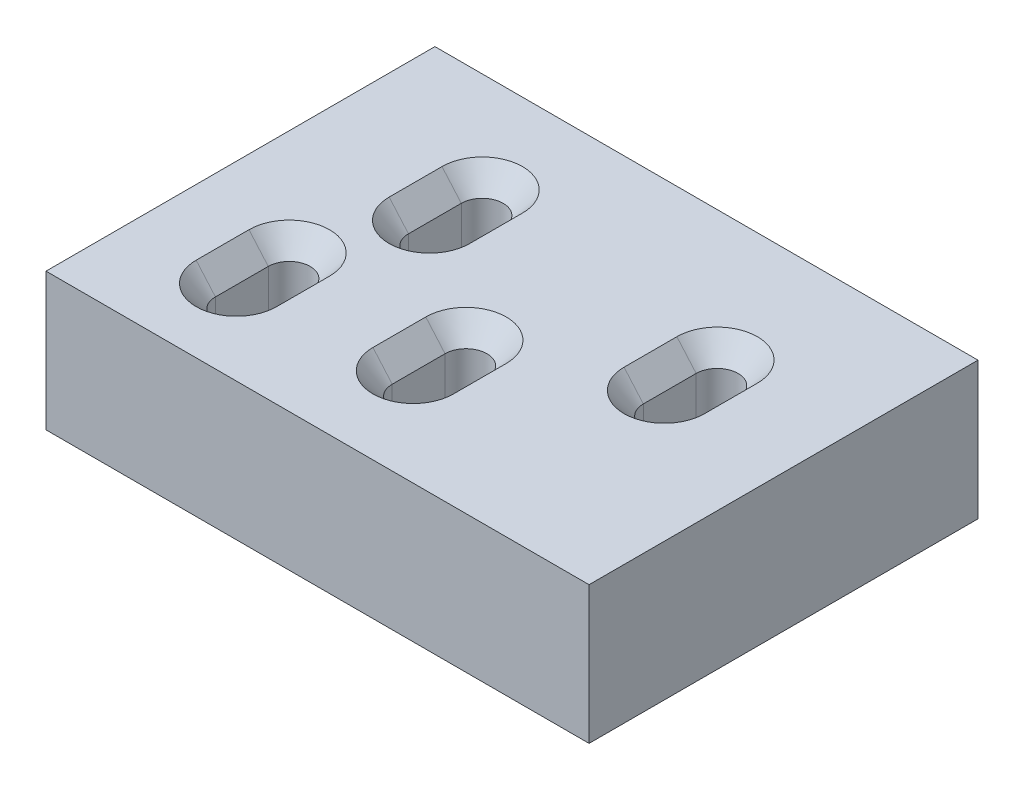
ISO-10303-21;
HEADER;
FILE_DESCRIPTION(('STEP AP214'),'2;1');
FILE_NAME('part.step','',(''),(''),'','','');
FILE_SCHEMA(('AUTOMOTIVE_DESIGN { 1 0 10303 214 1 1 1 1 }'));
ENDSEC;
DATA;
#1=APPLICATION_CONTEXT('core data for automotive mechanical design processes');
#2=APPLICATION_PROTOCOL_DEFINITION('international standard','automotive_design',2000,#1);
#3=PRODUCT_CONTEXT('',#1,'mechanical');
#4=PRODUCT('Part','Part','',(#3));
#5=PRODUCT_RELATED_PRODUCT_CATEGORY('part','',(#4));
#6=PRODUCT_DEFINITION_FORMATION('','',#4);
#7=PRODUCT_DEFINITION_CONTEXT('part definition',#1,'design');
#8=PRODUCT_DEFINITION('design','',#6,#7);
#9=PRODUCT_DEFINITION_SHAPE('','',#8);
#10=(LENGTH_UNIT() NAMED_UNIT(*) SI_UNIT(.MILLI.,.METRE.));
#11=(NAMED_UNIT(*) PLANE_ANGLE_UNIT() SI_UNIT($,.RADIAN.));
#12=(NAMED_UNIT(*) SI_UNIT($,.STERADIAN.) SOLID_ANGLE_UNIT());
#13=UNCERTAINTY_MEASURE_WITH_UNIT(LENGTH_MEASURE(1.E-05),#10,'distance_accuracy_value','');
#14=(GEOMETRIC_REPRESENTATION_CONTEXT(3) GLOBAL_UNCERTAINTY_ASSIGNED_CONTEXT((#13)) GLOBAL_UNIT_ASSIGNED_CONTEXT((#10,
#11,#12)) REPRESENTATION_CONTEXT('',''));
#15=CARTESIAN_POINT('',(0.,0.,0.));
#16=DIRECTION('',(0.,0.,1.));
#17=DIRECTION('',(1.,0.,0.));
#18=AXIS2_PLACEMENT_3D('',#15,#16,#17);
#19=CARTESIAN_POINT('',(0.,33.0460220728574,0.));
#20=DIRECTION('',(0.,-1.,0.));
#21=DIRECTION('',(0.,0.,-1.));
#22=AXIS2_PLACEMENT_3D('',#19,#20,#21);
#23=PLANE('',#22);
#24=DIRECTION('',(0.,0.,-1.));
#25=VECTOR('',#24,1.);
#26=CARTESIAN_POINT('',(108.83268436767,33.0460220728574,-49.4842006002132));
#27=LINE('',#26,#25);
#28=CARTESIAN_POINT('',(108.83268436767,33.0460220728574,-49.4842006002132));
#29=VERTEX_POINT('',#28);
#30=CARTESIAN_POINT('',(108.83268436767,33.0460220728574,-62.1842006002133));
#31=VERTEX_POINT('',#30);
#32=EDGE_CURVE('E567',#29,#31,#27,.T.);
#33=ORIENTED_EDGE('',*,*,#32,.F.);
#34=CARTESIAN_POINT('',(99.1552843676699,33.0460220728574,-49.4842006002132));
#35=DIRECTION('',(0.,1.,0.));
#36=DIRECTION('',(0.,0.,1.));
#37=AXIS2_PLACEMENT_3D('',#34,#35,#36);
#38=CIRCLE('',#37,9.6774);
#39=CARTESIAN_POINT('',(89.4778843676698,33.0460220728574,-49.4842006002131));
#40=VERTEX_POINT('',#39);
#41=EDGE_CURVE('E586',#40,#29,#38,.T.);
#42=ORIENTED_EDGE('',*,*,#41,.F.);
#43=DIRECTION('',(0.,0.,-1.));
#44=VECTOR('',#43,1.);
#45=CARTESIAN_POINT('',(89.4778843676699,33.0460220728574,-49.4842006002131));
#46=LINE('',#45,#44);
#47=CARTESIAN_POINT('',(89.4778843676698,33.0460220728574,-62.1842006002131));
#48=VERTEX_POINT('',#47);
#49=EDGE_CURVE('E575',#40,#48,#46,.T.);
#50=ORIENTED_EDGE('',*,*,#49,.T.);
#51=CARTESIAN_POINT('',(99.1552843676698,33.0460220728574,-62.1842006002132));
#52=DIRECTION('',(0.,1.,0.));
#53=DIRECTION('',(0.,0.,1.));
#54=AXIS2_PLACEMENT_3D('',#51,#52,#53);
#55=CIRCLE('',#54,9.6774);
#56=EDGE_CURVE('E601',#31,#48,#55,.T.);
#57=ORIENTED_EDGE('',*,*,#56,.F.);
#58=EDGE_LOOP('',(#33,#42,#50,#57));
#59=FACE_BOUND('',#58,.T.);
#60=DIRECTION('',(0.,0.,-1.));
#61=VECTOR('',#60,1.);
#62=CARTESIAN_POINT('',(35.1220750134339,33.0460220728574,-20.3284721091227));
#63=LINE('',#62,#61);
#64=CARTESIAN_POINT('',(35.1220750134339,33.0460220728574,-20.3284721091226));
#65=VERTEX_POINT('',#64);
#66=CARTESIAN_POINT('',(35.1220750134339,33.0460220728574,-33.0284721091227));
#67=VERTEX_POINT('',#66);
#68=EDGE_CURVE('E651',#65,#67,#63,.T.);
#69=ORIENTED_EDGE('',*,*,#68,.F.);
#70=CARTESIAN_POINT('',(25.4446750134339,33.0460220728574,-20.3284721091226));
#71=DIRECTION('',(0.,1.,0.));
#72=DIRECTION('',(0.,0.,1.));
#73=AXIS2_PLACEMENT_3D('',#70,#71,#72);
#74=CIRCLE('',#73,9.6774);
#75=CARTESIAN_POINT('',(15.7672750134338,33.0460220728574,-20.3284721091226));
#76=VERTEX_POINT('',#75);
#77=EDGE_CURVE('E670',#76,#65,#74,.T.);
#78=ORIENTED_EDGE('',*,*,#77,.F.);
#79=DIRECTION('',(0.,0.,-1.));
#80=VECTOR('',#79,1.);
#81=CARTESIAN_POINT('',(15.7672750134339,33.0460220728574,-20.3284721091226));
#82=LINE('',#81,#80);
#83=CARTESIAN_POINT('',(15.7672750134339,33.0460220728574,-33.0284721091226));
#84=VERTEX_POINT('',#83);
#85=EDGE_CURVE('E659',#76,#84,#82,.T.);
#86=ORIENTED_EDGE('',*,*,#85,.T.);
#87=CARTESIAN_POINT('',(25.4446750134339,33.0460220728574,-33.0284721091226));
#88=DIRECTION('',(0.,1.,0.));
#89=DIRECTION('',(0.,0.,1.));
#90=AXIS2_PLACEMENT_3D('',#87,#88,#89);
#91=CIRCLE('',#90,9.6774);
#92=EDGE_CURVE('E685',#67,#84,#91,.T.);
#93=ORIENTED_EDGE('',*,*,#92,.F.);
#94=EDGE_LOOP('',(#69,#78,#86,#93));
#95=FACE_BOUND('',#94,.T.);
#96=DIRECTION('',(0.,0.,1.));
#97=VECTOR('',#96,1.);
#98=CARTESIAN_POINT('',(0.,33.0460220728574,0.));
#99=LINE('',#98,#97);
#100=CARTESIAN_POINT('',(0.,33.0460220728574,-93.4974014014014));
#101=VERTEX_POINT('',#100);
#102=CARTESIAN_POINT('',(0.,33.0460220728574,0.));
#103=VERTEX_POINT('',#102);
#104=EDGE_CURVE('E694',#101,#103,#99,.T.);
#105=ORIENTED_EDGE('',*,*,#104,.T.);
#106=DIRECTION('',(1.,0.,0.));
#107=VECTOR('',#106,1.);
#108=CARTESIAN_POINT('',(0.,33.0460220728574,0.));
#109=LINE('',#108,#107);
#110=CARTESIAN_POINT('',(130.554298298298,33.0460220728574,0.));
#111=VERTEX_POINT('',#110);
#112=EDGE_CURVE('E697',#103,#111,#109,.T.);
#113=ORIENTED_EDGE('',*,*,#112,.T.);
#114=DIRECTION('',(0.,0.,-1.));
#115=VECTOR('',#114,1.);
#116=CARTESIAN_POINT('',(130.554298298298,33.0460220728574,0.));
#117=LINE('',#116,#115);
#118=CARTESIAN_POINT('',(130.554298298298,33.0460220728574,-93.4974014014014));
#119=VERTEX_POINT('',#118);
#120=EDGE_CURVE('E700',#111,#119,#117,.T.);
#121=ORIENTED_EDGE('',*,*,#120,.T.);
#122=DIRECTION('',(-1.,0.,0.));
#123=VECTOR('',#122,1.);
#124=CARTESIAN_POINT('',(0.,33.0460220728574,-93.4974014014014));
#125=LINE('',#124,#123);
#126=EDGE_CURVE('E702',#119,#101,#125,.T.);
#127=ORIENTED_EDGE('',*,*,#126,.T.);
#128=EDGE_LOOP('',(#105,#113,#121,#127));
#129=FACE_BOUND('',#128,.T.);
#130=DIRECTION('',(0.,0.,-1.));
#131=VECTOR('',#130,1.);
#132=CARTESIAN_POINT('',(74.5439050858944,33.0460220728574,-23.4083025835337));
#133=LINE('',#132,#131);
#134=CARTESIAN_POINT('',(74.5439050858944,33.0460220728574,-23.4083025835336));
#135=VERTEX_POINT('',#134);
#136=CARTESIAN_POINT('',(74.5439050858943,33.0460220728574,-36.1083025835337));
#137=VERTEX_POINT('',#136);
#138=EDGE_CURVE('E609',#135,#137,#133,.T.);
#139=ORIENTED_EDGE('',*,*,#138,.F.);
#140=CARTESIAN_POINT('',(64.8665050858944,33.0460220728574,-23.4083025835336));
#141=DIRECTION('',(0.,1.,0.));
#142=DIRECTION('',(0.,0.,1.));
#143=AXIS2_PLACEMENT_3D('',#140,#141,#142);
#144=CIRCLE('',#143,9.6774);
#145=CARTESIAN_POINT('',(55.1891050858943,33.0460220728574,-23.4083025835335));
#146=VERTEX_POINT('',#145);
#147=EDGE_CURVE('E628',#146,#135,#144,.T.);
#148=ORIENTED_EDGE('',*,*,#147,.F.);
#149=DIRECTION('',(0.,0.,-1.));
#150=VECTOR('',#149,1.);
#151=CARTESIAN_POINT('',(55.1891050858944,33.0460220728574,-23.4083025835335));
#152=LINE('',#151,#150);
#153=CARTESIAN_POINT('',(55.1891050858943,33.0460220728574,-36.1083025835335));
#154=VERTEX_POINT('',#153);
#155=EDGE_CURVE('E617',#146,#154,#152,.T.);
#156=ORIENTED_EDGE('',*,*,#155,.T.);
#157=CARTESIAN_POINT('',(64.8665050858943,33.0460220728574,-36.1083025835336));
#158=DIRECTION('',(0.,1.,0.));
#159=DIRECTION('',(0.,0.,1.));
#160=AXIS2_PLACEMENT_3D('',#157,#158,#159);
#161=CIRCLE('',#160,9.6774);
#162=EDGE_CURVE('E643',#137,#154,#161,.T.);
#163=ORIENTED_EDGE('',*,*,#162,.F.);
#164=EDGE_LOOP('',(#139,#148,#156,#163));
#165=FACE_BOUND('',#164,.T.);
#166=DIRECTION('',(0.,0.,-1.));
#167=VECTOR('',#166,1.);
#168=CARTESIAN_POINT('',(45.1828545631765,33.0460220728574,-56.6704717071722));
#169=LINE('',#168,#167);
#170=CARTESIAN_POINT('',(45.1828545631765,33.0460220728574,-56.6704717071721));
#171=VERTEX_POINT('',#170);
#172=CARTESIAN_POINT('',(45.1828545631764,33.0460220728574,-69.3704717071722));
#173=VERTEX_POINT('',#172);
#174=EDGE_CURVE('E543',#171,#173,#169,.T.);
#175=ORIENTED_EDGE('',*,*,#174,.F.);
#176=CARTESIAN_POINT('',(35.5054545631765,33.0460220728574,-56.6704717071721));
#177=DIRECTION('',(0.,1.,0.));
#178=DIRECTION('',(0.,0.,1.));
#179=AXIS2_PLACEMENT_3D('',#176,#177,#178);
#180=CIRCLE('',#179,9.6774);
#181=CARTESIAN_POINT('',(25.8280545631765,33.0460220728574,-56.670471707172));
#182=VERTEX_POINT('',#181);
#183=EDGE_CURVE('E524',#182,#171,#180,.T.);
#184=ORIENTED_EDGE('',*,*,#183,.F.);
#185=DIRECTION('',(0.,0.,-1.));
#186=VECTOR('',#185,1.);
#187=CARTESIAN_POINT('',(25.8280545631765,33.0460220728574,-56.670471707172));
#188=LINE('',#187,#186);
#189=CARTESIAN_POINT('',(25.8280545631764,33.0460220728574,-69.370471707172));
#190=VERTEX_POINT('',#189);
#191=EDGE_CURVE('E548',#182,#190,#188,.T.);
#192=ORIENTED_EDGE('',*,*,#191,.T.);
#193=CARTESIAN_POINT('',(35.5054545631764,33.0460220728574,-69.3704717071721));
#194=DIRECTION('',(0.,1.,0.));
#195=DIRECTION('',(0.,0.,1.));
#196=AXIS2_PLACEMENT_3D('',#193,#194,#195);
#197=CIRCLE('',#196,9.6774);
#198=EDGE_CURVE('E559',#173,#190,#197,.T.);
#199=ORIENTED_EDGE('',*,*,#198,.F.);
#200=EDGE_LOOP('',(#175,#184,#192,#199));
#201=FACE_BOUND('',#200,.T.);
#202=ADVANCED_FACE('F333',(#59,#95,#129,#165,#201),#23,.F.);
#203=CARTESIAN_POINT('',(0.,33.0460220728574,0.));
#204=DIRECTION('',(1.,0.,0.));
#205=DIRECTION('',(0.,0.,-1.));
#206=AXIS2_PLACEMENT_3D('',#203,#204,#205);
#207=PLANE('',#206);
#208=DIRECTION('',(0.,0.,1.));
#209=VECTOR('',#208,1.);
#210=CARTESIAN_POINT('',(0.,0.,0.));
#211=LINE('',#210,#209);
#212=CARTESIAN_POINT('',(0.,0.,-93.4974014014014));
#213=VERTEX_POINT('',#212);
#214=CARTESIAN_POINT('',(0.,0.,0.));
#215=VERTEX_POINT('',#214);
#216=EDGE_CURVE('E693',#213,#215,#211,.T.);
#217=ORIENTED_EDGE('',*,*,#216,.T.);
#218=DIRECTION('',(0.,-1.,0.));
#219=VECTOR('',#218,1.);
#220=CARTESIAN_POINT('',(0.,33.0460220728574,0.));
#221=LINE('',#220,#219);
#222=EDGE_CURVE('E720',#103,#215,#221,.T.);
#223=ORIENTED_EDGE('',*,*,#222,.F.);
#224=ORIENTED_EDGE('',*,*,#104,.F.);
#225=DIRECTION('',(0.,-1.,0.));
#226=VECTOR('',#225,1.);
#227=CARTESIAN_POINT('',(0.,33.0460220728574,-93.4974014014014));
#228=LINE('',#227,#226);
#229=EDGE_CURVE('E704',#101,#213,#228,.T.);
#230=ORIENTED_EDGE('',*,*,#229,.T.);
#231=EDGE_LOOP('',(#217,#223,#224,#230));
#232=FACE_BOUND('',#231,.T.);
#233=ADVANCED_FACE('F335',(#232),#207,.F.);
#234=CARTESIAN_POINT('',(0.,33.0460220728574,0.));
#235=DIRECTION('',(0.,0.,-1.));
#236=DIRECTION('',(-1.,0.,0.));
#237=AXIS2_PLACEMENT_3D('',#234,#235,#236);
#238=PLANE('',#237);
#239=DIRECTION('',(1.,0.,0.));
#240=VECTOR('',#239,1.);
#241=CARTESIAN_POINT('',(0.,0.,0.));
#242=LINE('',#241,#240);
#243=CARTESIAN_POINT('',(130.554298298298,0.,0.));
#244=VERTEX_POINT('',#243);
#245=EDGE_CURVE('E707',#215,#244,#242,.T.);
#246=ORIENTED_EDGE('',*,*,#245,.T.);
#247=DIRECTION('',(0.,-1.,0.));
#248=VECTOR('',#247,1.);
#249=CARTESIAN_POINT('',(130.554298298298,33.0460220728574,0.));
#250=LINE('',#249,#248);
#251=EDGE_CURVE('E717',#111,#244,#250,.T.);
#252=ORIENTED_EDGE('',*,*,#251,.F.);
#253=ORIENTED_EDGE('',*,*,#112,.F.);
#254=ORIENTED_EDGE('',*,*,#222,.T.);
#255=EDGE_LOOP('',(#246,#252,#253,#254));
#256=FACE_BOUND('',#255,.T.);
#257=ADVANCED_FACE('F790',(#256),#238,.F.);
#258=CARTESIAN_POINT('',(130.554298298298,33.0460220728574,0.));
#259=DIRECTION('',(-1.,0.,0.));
#260=DIRECTION('',(0.,0.,1.));
#261=AXIS2_PLACEMENT_3D('',#258,#259,#260);
#262=PLANE('',#261);
#263=DIRECTION('',(0.,0.,-1.));
#264=VECTOR('',#263,1.);
#265=CARTESIAN_POINT('',(130.554298298298,0.,0.));
#266=LINE('',#265,#264);
#267=CARTESIAN_POINT('',(130.554298298298,0.,-93.4974014014014));
#268=VERTEX_POINT('',#267);
#269=EDGE_CURVE('E709',#244,#268,#266,.T.);
#270=ORIENTED_EDGE('',*,*,#269,.T.);
#271=DIRECTION('',(0.,-1.,0.));
#272=VECTOR('',#271,1.);
#273=CARTESIAN_POINT('',(130.554298298298,33.0460220728574,-93.4974014014014));
#274=LINE('',#273,#272);
#275=EDGE_CURVE('E714',#119,#268,#274,.T.);
#276=ORIENTED_EDGE('',*,*,#275,.F.);
#277=ORIENTED_EDGE('',*,*,#120,.F.);
#278=ORIENTED_EDGE('',*,*,#251,.T.);
#279=EDGE_LOOP('',(#270,#276,#277,#278));
#280=FACE_BOUND('',#279,.T.);
#281=ADVANCED_FACE('F802',(#280),#262,.F.);
#282=CARTESIAN_POINT('',(0.,33.0460220728574,-93.4974014014014));
#283=DIRECTION('',(0.,0.,1.));
#284=DIRECTION('',(1.,0.,0.));
#285=AXIS2_PLACEMENT_3D('',#282,#283,#284);
#286=PLANE('',#285);
#287=DIRECTION('',(-1.,0.,0.));
#288=VECTOR('',#287,1.);
#289=CARTESIAN_POINT('',(0.,0.,-93.4974014014014));
#290=LINE('',#289,#288);
#291=EDGE_CURVE('E698',#268,#213,#290,.T.);
#292=ORIENTED_EDGE('',*,*,#291,.T.);
#293=ORIENTED_EDGE('',*,*,#229,.F.);
#294=ORIENTED_EDGE('',*,*,#126,.F.);
#295=ORIENTED_EDGE('',*,*,#275,.T.);
#296=EDGE_LOOP('',(#292,#293,#294,#295));
#297=FACE_BOUND('',#296,.T.);
#298=ADVANCED_FACE('F799',(#297),#286,.F.);
#299=CARTESIAN_POINT('',(0.,0.,0.));
#300=DIRECTION('',(0.,-1.,0.));
#301=DIRECTION('',(0.,0.,-1.));
#302=AXIS2_PLACEMENT_3D('',#299,#300,#301);
#303=PLANE('',#302);
#304=DIRECTION('',(0.,0.,-1.));
#305=VECTOR('',#304,1.);
#306=CARTESIAN_POINT('',(30.4635545631768,0.,-1.99732320991911E-13));
#307=LINE('',#306,#305);
#308=CARTESIAN_POINT('',(30.4635545631765,0.,-56.6704717071721));
#309=VERTEX_POINT('',#308);
#310=CARTESIAN_POINT('',(30.4635545631764,0.,-69.3704717071721));
#311=VERTEX_POINT('',#310);
#312=EDGE_CURVE('E13',#309,#311,#307,.T.);
#313=ORIENTED_EDGE('',*,*,#312,.F.);
#314=CARTESIAN_POINT('',(35.5054545631765,0.,-56.6704717071721));
#315=DIRECTION('',(0.,-1.,0.));
#316=DIRECTION('',(0.,0.,-1.));
#317=AXIS2_PLACEMENT_3D('',#314,#315,#316);
#318=CIRCLE('',#317,5.04189999999999);
#319=CARTESIAN_POINT('',(40.5473545631764,0.,-56.6704717071721));
#320=VERTEX_POINT('',#319);
#321=EDGE_CURVE('E751',#320,#309,#318,.T.);
#322=ORIENTED_EDGE('',*,*,#321,.F.);
#323=DIRECTION('',(0.,0.,1.));
#324=VECTOR('',#323,1.);
#325=CARTESIAN_POINT('',(40.5473545631768,0.,-2.65846102108339E-13));
#326=LINE('',#325,#324);
#327=CARTESIAN_POINT('',(40.5473545631764,0.,-69.3704717071721));
#328=VERTEX_POINT('',#327);
#329=EDGE_CURVE('E522',#328,#320,#326,.T.);
#330=ORIENTED_EDGE('',*,*,#329,.F.);
#331=CARTESIAN_POINT('',(35.5054545631764,0.,-69.3704717071721));
#332=DIRECTION('',(0.,-1.,0.));
#333=DIRECTION('',(0.,0.,-1.));
#334=AXIS2_PLACEMENT_3D('',#331,#332,#333);
#335=CIRCLE('',#334,5.04189999999999);
#336=EDGE_CURVE('E341',#311,#328,#335,.T.);
#337=ORIENTED_EDGE('',*,*,#336,.F.);
#338=EDGE_LOOP('',(#313,#322,#330,#337));
#339=FACE_BOUND('',#338,.T.);
#340=DIRECTION('',(0.,0.,-1.));
#341=VECTOR('',#340,1.);
#342=CARTESIAN_POINT('',(94.1133843676702,0.,-6.17048304628256E-13));
#343=LINE('',#342,#341);
#344=CARTESIAN_POINT('',(94.1133843676699,0.,-49.4842006002131));
#345=VERTEX_POINT('',#344);
#346=CARTESIAN_POINT('',(94.1133843676698,0.,-62.1842006002131));
#347=VERTEX_POINT('',#346);
#348=EDGE_CURVE('E748',#345,#347,#343,.T.);
#349=ORIENTED_EDGE('',*,*,#348,.F.);
#350=CARTESIAN_POINT('',(99.1552843676699,0.,-49.4842006002132));
#351=DIRECTION('',(0.,-1.,0.));
#352=DIRECTION('',(0.,0.,-1.));
#353=AXIS2_PLACEMENT_3D('',#350,#351,#352);
#354=CIRCLE('',#353,5.04189999999999);
#355=CARTESIAN_POINT('',(104.19718436767,0.,-49.4842006002132));
#356=VERTEX_POINT('',#355);
#357=EDGE_CURVE('E744',#356,#345,#354,.T.);
#358=ORIENTED_EDGE('',*,*,#357,.F.);
#359=DIRECTION('',(0.,0.,1.));
#360=VECTOR('',#359,1.);
#361=CARTESIAN_POINT('',(104.19718436767,0.,-6.83162085744684E-13));
#362=LINE('',#361,#360);
#363=CARTESIAN_POINT('',(104.19718436767,0.,-62.1842006002132));
#364=VERTEX_POINT('',#363);
#365=EDGE_CURVE('E741',#364,#356,#362,.T.);
#366=ORIENTED_EDGE('',*,*,#365,.F.);
#367=CARTESIAN_POINT('',(99.1552843676698,0.,-62.1842006002132));
#368=DIRECTION('',(0.,-1.,0.));
#369=DIRECTION('',(0.,0.,-1.));
#370=AXIS2_PLACEMENT_3D('',#367,#368,#369);
#371=CIRCLE('',#370,5.04189999999999);
#372=EDGE_CURVE('E746',#347,#364,#371,.T.);
#373=ORIENTED_EDGE('',*,*,#372,.F.);
#374=EDGE_LOOP('',(#349,#358,#366,#373));
#375=FACE_BOUND('',#374,.T.);
#376=DIRECTION('',(0.,0.,-1.));
#377=VECTOR('',#376,1.);
#378=CARTESIAN_POINT('',(59.8246050858946,0.,-3.92236145701579E-13));
#379=LINE('',#378,#377);
#380=CARTESIAN_POINT('',(59.8246050858944,0.,-23.4083025835336));
#381=VERTEX_POINT('',#380);
#382=CARTESIAN_POINT('',(59.8246050858943,0.,-36.1083025835336));
#383=VERTEX_POINT('',#382);
#384=EDGE_CURVE('E739',#381,#383,#379,.T.);
#385=ORIENTED_EDGE('',*,*,#384,.F.);
#386=CARTESIAN_POINT('',(64.8665050858944,0.,-23.4083025835336));
#387=DIRECTION('',(0.,-1.,0.));
#388=DIRECTION('',(0.,0.,-1.));
#389=AXIS2_PLACEMENT_3D('',#386,#387,#388);
#390=CIRCLE('',#389,5.04189999999999);
#391=CARTESIAN_POINT('',(69.9084050858944,0.,-23.4083025835336));
#392=VERTEX_POINT('',#391);
#393=EDGE_CURVE('E735',#392,#381,#390,.T.);
#394=ORIENTED_EDGE('',*,*,#393,.F.);
#395=DIRECTION('',(0.,0.,1.));
#396=VECTOR('',#395,1.);
#397=CARTESIAN_POINT('',(69.9084050858945,0.,-4.58349926818007E-13));
#398=LINE('',#397,#396);
#399=CARTESIAN_POINT('',(69.9084050858943,0.,-36.1083025835336));
#400=VERTEX_POINT('',#399);
#401=EDGE_CURVE('E732',#400,#392,#398,.T.);
#402=ORIENTED_EDGE('',*,*,#401,.F.);
#403=CARTESIAN_POINT('',(64.8665050858943,0.,-36.1083025835336));
#404=DIRECTION('',(0.,-1.,0.));
#405=DIRECTION('',(0.,0.,-1.));
#406=AXIS2_PLACEMENT_3D('',#403,#404,#405);
#407=CIRCLE('',#406,5.04189999999999);
#408=EDGE_CURVE('E737',#383,#400,#407,.T.);
#409=ORIENTED_EDGE('',*,*,#408,.F.);
#410=EDGE_LOOP('',(#385,#394,#402,#409));
#411=FACE_BOUND('',#410,.T.);
#412=DIRECTION('',(0.,0.,-1.));
#413=VECTOR('',#412,1.);
#414=CARTESIAN_POINT('',(20.4027750134341,0.,-1.3376947196552E-13));
#415=LINE('',#414,#413);
#416=CARTESIAN_POINT('',(20.402775013434,0.,-20.3284721091226));
#417=VERTEX_POINT('',#416);
#418=CARTESIAN_POINT('',(20.4027750134339,0.,-33.0284721091226));
#419=VERTEX_POINT('',#418);
#420=EDGE_CURVE('E730',#417,#419,#415,.T.);
#421=ORIENTED_EDGE('',*,*,#420,.F.);
#422=CARTESIAN_POINT('',(25.4446750134339,0.,-20.3284721091226));
#423=DIRECTION('',(0.,-1.,0.));
#424=DIRECTION('',(0.,0.,-1.));
#425=AXIS2_PLACEMENT_3D('',#422,#423,#424);
#426=CIRCLE('',#425,5.04189999999999);
#427=CARTESIAN_POINT('',(30.4865750134339,0.,-20.3284721091226));
#428=VERTEX_POINT('',#427);
#429=EDGE_CURVE('E726',#428,#417,#426,.T.);
#430=ORIENTED_EDGE('',*,*,#429,.F.);
#431=DIRECTION('',(0.,0.,1.));
#432=VECTOR('',#431,1.);
#433=CARTESIAN_POINT('',(30.4865750134341,0.,-1.99883253081948E-13));
#434=LINE('',#433,#432);
#435=CARTESIAN_POINT('',(30.4865750134339,0.,-33.0284721091226));
#436=VERTEX_POINT('',#435);
#437=EDGE_CURVE('E723',#436,#428,#434,.T.);
#438=ORIENTED_EDGE('',*,*,#437,.F.);
#439=CARTESIAN_POINT('',(25.4446750134339,0.,-33.0284721091226));
#440=DIRECTION('',(0.,-1.,0.));
#441=DIRECTION('',(0.,0.,-1.));
#442=AXIS2_PLACEMENT_3D('',#439,#440,#441);
#443=CIRCLE('',#442,5.04189999999999);
#444=EDGE_CURVE('E728',#419,#436,#443,.T.);
#445=ORIENTED_EDGE('',*,*,#444,.F.);
#446=EDGE_LOOP('',(#421,#430,#438,#445));
#447=FACE_BOUND('',#446,.T.);
#448=ORIENTED_EDGE('',*,*,#216,.F.);
#449=ORIENTED_EDGE('',*,*,#291,.F.);
#450=ORIENTED_EDGE('',*,*,#269,.F.);
#451=ORIENTED_EDGE('',*,*,#245,.F.);
#452=EDGE_LOOP('',(#448,#449,#450,#451));
#453=FACE_BOUND('',#452,.T.);
#454=ADVANCED_FACE('F758',(#339,#375,#411,#447,#453),#303,.T.);
#455=CARTESIAN_POINT('',(25.4446750134339,33.0460220728574,-33.0284721091226));
#456=DIRECTION('',(0.,1.,0.));
#457=DIRECTION('',(0.,0.,1.));
#458=AXIS2_PLACEMENT_3D('',#455,#456,#457);
#459=CYLINDRICAL_SURFACE('',#458,5.04189999999999);
#460=ORIENTED_EDGE('',*,*,#444,.T.);
#461=DIRECTION('',(0.,-1.,0.));
#462=VECTOR('',#461,1.);
#463=CARTESIAN_POINT('',(30.4865750134339,-0.001000000000001,-33.0284721091226));
#464=LINE('',#463,#462);
#465=CARTESIAN_POINT('',(30.4865750134339,27.7134893211844,-33.0284721091227));
#466=VERTEX_POINT('',#465);
#467=EDGE_CURVE('E682',#466,#436,#464,.T.);
#468=ORIENTED_EDGE('',*,*,#467,.F.);
#469=CARTESIAN_POINT('',(25.4446750134339,27.7134893211844,-33.0284721091226));
#470=DIRECTION('',(0.,1.,0.));
#471=DIRECTION('',(0.,0.,1.));
#472=AXIS2_PLACEMENT_3D('',#469,#470,#471);
#473=CIRCLE('',#472,5.0419);
#474=CARTESIAN_POINT('',(20.4027750134339,27.7134893211844,-33.0284721091226));
#475=VERTEX_POINT('',#474);
#476=EDGE_CURVE('E688',#466,#475,#473,.T.);
#477=ORIENTED_EDGE('',*,*,#476,.T.);
#478=DIRECTION('',(0.,1.,0.));
#479=VECTOR('',#478,1.);
#480=CARTESIAN_POINT('',(20.4027750134339,33.0460220728574,-33.0284721091226));
#481=LINE('',#480,#479);
#482=EDGE_CURVE('E677',#419,#475,#481,.T.);
#483=ORIENTED_EDGE('',*,*,#482,.F.);
#484=EDGE_LOOP('',(#460,#468,#477,#483));
#485=FACE_BOUND('',#484,.T.);
#486=ADVANCED_FACE('F796',(#485),#459,.F.);
#487=CARTESIAN_POINT('',(25.4446750134339,33.0460220728574,-20.3284721091226));
#488=DIRECTION('',(0.,1.,0.));
#489=DIRECTION('',(0.,0.,1.));
#490=AXIS2_PLACEMENT_3D('',#487,#488,#489);
#491=CYLINDRICAL_SURFACE('',#490,5.04189999999999);
#492=ORIENTED_EDGE('',*,*,#429,.T.);
#493=DIRECTION('',(0.,1.,0.));
#494=VECTOR('',#493,1.);
#495=CARTESIAN_POINT('',(20.402775013434,33.0460220728574,-20.3284721091226));
#496=LINE('',#495,#494);
#497=CARTESIAN_POINT('',(20.402775013434,27.7134893211844,-20.3284721091226));
#498=VERTEX_POINT('',#497);
#499=EDGE_CURVE('E662',#498,#417,#496,.F.);
#500=ORIENTED_EDGE('',*,*,#499,.F.);
#501=CARTESIAN_POINT('',(25.4446750134339,27.7134893211844,-20.3284721091226));
#502=DIRECTION('',(0.,1.,0.));
#503=DIRECTION('',(0.,0.,1.));
#504=AXIS2_PLACEMENT_3D('',#501,#502,#503);
#505=CIRCLE('',#504,5.0419);
#506=CARTESIAN_POINT('',(30.4865750134339,27.7134893211844,-20.3284721091227));
#507=VERTEX_POINT('',#506);
#508=EDGE_CURVE('E672',#498,#507,#505,.T.);
#509=ORIENTED_EDGE('',*,*,#508,.T.);
#510=DIRECTION('',(0.,-1.,0.));
#511=VECTOR('',#510,1.);
#512=CARTESIAN_POINT('',(30.4865750134339,-0.001000000000001,-20.3284721091226));
#513=LINE('',#512,#511);
#514=EDGE_CURVE('E668',#507,#428,#513,.T.);
#515=ORIENTED_EDGE('',*,*,#514,.T.);
#516=EDGE_LOOP('',(#492,#500,#509,#515));
#517=FACE_BOUND('',#516,.T.);
#518=ADVANCED_FACE('F885',(#517),#491,.F.);
#519=CARTESIAN_POINT('',(20.402775013434,33.0460220728574,-20.3284721091226));
#520=DIRECTION('',(-1.,0.,0.));
#521=DIRECTION('',(0.,0.,1.));
#522=AXIS2_PLACEMENT_3D('',#519,#520,#521);
#523=PLANE('',#522);
#524=ORIENTED_EDGE('',*,*,#420,.T.);
#525=ORIENTED_EDGE('',*,*,#482,.T.);
#526=DIRECTION('',(0.,0.,-1.));
#527=VECTOR('',#526,1.);
#528=CARTESIAN_POINT('',(20.4027750134339,27.7134893211844,-20.3284721091226));
#529=LINE('',#528,#527);
#530=EDGE_CURVE('E656',#498,#475,#529,.T.);
#531=ORIENTED_EDGE('',*,*,#530,.F.);
#532=ORIENTED_EDGE('',*,*,#499,.T.);
#533=EDGE_LOOP('',(#524,#525,#531,#532));
#534=FACE_BOUND('',#533,.T.);
#535=ADVANCED_FACE('F864',(#534),#523,.F.);
#536=CARTESIAN_POINT('',(30.4865750134339,-0.001000000000001,-20.3284721091226));
#537=DIRECTION('',(1.,0.,0.));
#538=DIRECTION('',(0.,0.,-1.));
#539=AXIS2_PLACEMENT_3D('',#536,#537,#538);
#540=PLANE('',#539);
#541=ORIENTED_EDGE('',*,*,#437,.T.);
#542=ORIENTED_EDGE('',*,*,#514,.F.);
#543=DIRECTION('',(0.,0.,-1.));
#544=VECTOR('',#543,1.);
#545=CARTESIAN_POINT('',(30.4865750134339,27.7134893211844,-20.3284721091227));
#546=LINE('',#545,#544);
#547=EDGE_CURVE('E653',#507,#466,#546,.T.);
#548=ORIENTED_EDGE('',*,*,#547,.T.);
#549=ORIENTED_EDGE('',*,*,#467,.T.);
#550=EDGE_LOOP('',(#541,#542,#548,#549));
#551=FACE_BOUND('',#550,.T.);
#552=ADVANCED_FACE('F887',(#551),#540,.F.);
#553=CARTESIAN_POINT('',(25.4446750134339,33.0460220728574,-33.0284721091226));
#554=DIRECTION('',(0.,1.,0.));
#555=DIRECTION('',(0.,0.,1.));
#556=AXIS2_PLACEMENT_3D('',#553,#554,#555);
#557=CONICAL_SURFACE('',#556,9.6774,0.715584993317676);
#558=ORIENTED_EDGE('',*,*,#476,.F.);
#559=DIRECTION('',(-0.656059028990507,-0.754709580222772,0.));
#560=VECTOR('',#559,1.);
#561=CARTESIAN_POINT('',(30.4865750134339,27.7134893211844,-33.0284721091226));
#562=LINE('',#561,#560);
#563=EDGE_CURVE('E679',#67,#466,#562,.T.);
#564=ORIENTED_EDGE('',*,*,#563,.F.);
#565=ORIENTED_EDGE('',*,*,#92,.T.);
#566=DIRECTION('',(0.656059028990508,-0.754709580222772,0.));
#567=VECTOR('',#566,1.);
#568=CARTESIAN_POINT('',(25.4446750134339,21.9134468488168,-33.0284721091226));
#569=LINE('',#568,#567);
#570=EDGE_CURVE('E691',#475,#84,#569,.F.);
#571=ORIENTED_EDGE('',*,*,#570,.F.);
#572=EDGE_LOOP('',(#558,#564,#565,#571));
#573=FACE_BOUND('',#572,.T.);
#574=ADVANCED_FACE('F872',(#573),#557,.F.);
#575=CARTESIAN_POINT('',(25.4446750134339,33.0460220728574,-20.3284721091226));
#576=DIRECTION('',(0.,1.,0.));
#577=DIRECTION('',(0.,0.,1.));
#578=AXIS2_PLACEMENT_3D('',#575,#576,#577);
#579=CONICAL_SURFACE('',#578,9.6774,0.715584993317676);
#580=ORIENTED_EDGE('',*,*,#77,.T.);
#581=DIRECTION('',(-0.656059028990507,-0.754709580222772,0.));
#582=VECTOR('',#581,1.);
#583=CARTESIAN_POINT('',(30.4865750134339,27.7134893211844,-20.3284721091226));
#584=LINE('',#583,#582);
#585=EDGE_CURVE('E665',#65,#507,#584,.T.);
#586=ORIENTED_EDGE('',*,*,#585,.T.);
#587=ORIENTED_EDGE('',*,*,#508,.F.);
#588=DIRECTION('',(-0.656059028990508,0.754709580222772,0.));
#589=VECTOR('',#588,1.);
#590=CARTESIAN_POINT('',(25.4446750134339,21.9134468488168,-20.3284721091226));
#591=LINE('',#590,#589);
#592=EDGE_CURVE('E675',#76,#498,#591,.F.);
#593=ORIENTED_EDGE('',*,*,#592,.F.);
#594=EDGE_LOOP('',(#580,#586,#587,#593));
#595=FACE_BOUND('',#594,.T.);
#596=ADVANCED_FACE('F894',(#595),#579,.F.);
#597=CARTESIAN_POINT('',(25.4446750134339,21.9134468488168,-20.3284721091226));
#598=DIRECTION('',(-0.754709580222772,-0.656059028990508,0.));
#599=DIRECTION('',(0.656059028990508,-0.754709580222772,0.));
#600=AXIS2_PLACEMENT_3D('',#597,#598,#599);
#601=PLANE('',#600);
#602=ORIENTED_EDGE('',*,*,#570,.T.);
#603=ORIENTED_EDGE('',*,*,#85,.F.);
#604=ORIENTED_EDGE('',*,*,#592,.T.);
#605=ORIENTED_EDGE('',*,*,#530,.T.);
#606=EDGE_LOOP('',(#602,#603,#604,#605));
#607=FACE_BOUND('',#606,.T.);
#608=ADVANCED_FACE('F882',(#607),#601,.F.);
#609=CARTESIAN_POINT('',(30.4865750134339,27.7134893211844,-20.3284721091226));
#610=DIRECTION('',(0.754709580222772,-0.656059028990507,0.));
#611=DIRECTION('',(0.656059028990507,0.754709580222772,0.));
#612=AXIS2_PLACEMENT_3D('',#609,#610,#611);
#613=PLANE('',#612);
#614=ORIENTED_EDGE('',*,*,#563,.T.);
#615=ORIENTED_EDGE('',*,*,#547,.F.);
#616=ORIENTED_EDGE('',*,*,#585,.F.);
#617=ORIENTED_EDGE('',*,*,#68,.T.);
#618=EDGE_LOOP('',(#614,#615,#616,#617));
#619=FACE_BOUND('',#618,.T.);
#620=ADVANCED_FACE('F876',(#619),#613,.F.);
#621=CARTESIAN_POINT('',(64.8665050858943,33.0460220728574,-36.1083025835336));
#622=DIRECTION('',(0.,1.,0.));
#623=DIRECTION('',(0.,0.,1.));
#624=AXIS2_PLACEMENT_3D('',#621,#622,#623);
#625=CYLINDRICAL_SURFACE('',#624,5.04189999999999);
#626=ORIENTED_EDGE('',*,*,#408,.T.);
#627=DIRECTION('',(0.,-1.,0.));
#628=VECTOR('',#627,1.);
#629=CARTESIAN_POINT('',(69.9084050858943,-0.001000000000001,-36.1083025835336));
#630=LINE('',#629,#628);
#631=CARTESIAN_POINT('',(69.9084050858943,27.7134893211844,-36.1083025835336));
#632=VERTEX_POINT('',#631);
#633=EDGE_CURVE('E640',#632,#400,#630,.T.);
#634=ORIENTED_EDGE('',*,*,#633,.F.);
#635=CARTESIAN_POINT('',(64.8665050858943,27.7134893211844,-36.1083025835336));
#636=DIRECTION('',(0.,1.,0.));
#637=DIRECTION('',(0.,0.,1.));
#638=AXIS2_PLACEMENT_3D('',#635,#636,#637);
#639=CIRCLE('',#638,5.0419);
#640=CARTESIAN_POINT('',(59.8246050858943,27.7134893211844,-36.1083025835336));
#641=VERTEX_POINT('',#640);
#642=EDGE_CURVE('E646',#632,#641,#639,.T.);
#643=ORIENTED_EDGE('',*,*,#642,.T.);
#644=DIRECTION('',(0.,1.,0.));
#645=VECTOR('',#644,1.);
#646=CARTESIAN_POINT('',(59.8246050858943,33.0460220728574,-36.1083025835336));
#647=LINE('',#646,#645);
#648=EDGE_CURVE('E635',#383,#641,#647,.T.);
#649=ORIENTED_EDGE('',*,*,#648,.F.);
#650=EDGE_LOOP('',(#626,#634,#643,#649));
#651=FACE_BOUND('',#650,.T.);
#652=ADVANCED_FACE('F837',(#651),#625,.F.);
#653=CARTESIAN_POINT('',(64.8665050858944,33.0460220728574,-23.4083025835336));
#654=DIRECTION('',(0.,1.,0.));
#655=DIRECTION('',(0.,0.,1.));
#656=AXIS2_PLACEMENT_3D('',#653,#654,#655);
#657=CYLINDRICAL_SURFACE('',#656,5.04189999999999);
#658=ORIENTED_EDGE('',*,*,#393,.T.);
#659=DIRECTION('',(0.,1.,0.));
#660=VECTOR('',#659,1.);
#661=CARTESIAN_POINT('',(59.8246050858944,33.0460220728574,-23.4083025835336));
#662=LINE('',#661,#660);
#663=CARTESIAN_POINT('',(59.8246050858944,27.7134893211844,-23.4083025835336));
#664=VERTEX_POINT('',#663);
#665=EDGE_CURVE('E620',#664,#381,#662,.F.);
#666=ORIENTED_EDGE('',*,*,#665,.F.);
#667=CARTESIAN_POINT('',(64.8665050858944,27.7134893211844,-23.4083025835336));
#668=DIRECTION('',(0.,1.,0.));
#669=DIRECTION('',(0.,0.,1.));
#670=AXIS2_PLACEMENT_3D('',#667,#668,#669);
#671=CIRCLE('',#670,5.0419);
#672=CARTESIAN_POINT('',(69.9084050858944,27.7134893211844,-23.4083025835336));
#673=VERTEX_POINT('',#672);
#674=EDGE_CURVE('E630',#664,#673,#671,.T.);
#675=ORIENTED_EDGE('',*,*,#674,.T.);
#676=DIRECTION('',(0.,-1.,0.));
#677=VECTOR('',#676,1.);
#678=CARTESIAN_POINT('',(69.9084050858944,-0.001000000000001,-23.4083025835336));
#679=LINE('',#678,#677);
#680=EDGE_CURVE('E626',#673,#392,#679,.T.);
#681=ORIENTED_EDGE('',*,*,#680,.T.);
#682=EDGE_LOOP('',(#658,#666,#675,#681));
#683=FACE_BOUND('',#682,.T.);
#684=ADVANCED_FACE('F854',(#683),#657,.F.);
#685=CARTESIAN_POINT('',(59.8246050858944,33.0460220728574,-23.4083025835336));
#686=DIRECTION('',(-1.,0.,0.));
#687=DIRECTION('',(0.,0.,1.));
#688=AXIS2_PLACEMENT_3D('',#685,#686,#687);
#689=PLANE('',#688);
#690=ORIENTED_EDGE('',*,*,#384,.T.);
#691=ORIENTED_EDGE('',*,*,#648,.T.);
#692=DIRECTION('',(0.,0.,-1.));
#693=VECTOR('',#692,1.);
#694=CARTESIAN_POINT('',(59.8246050858944,27.7134893211844,-23.4083025835336));
#695=LINE('',#694,#693);
#696=EDGE_CURVE('E614',#664,#641,#695,.T.);
#697=ORIENTED_EDGE('',*,*,#696,.F.);
#698=ORIENTED_EDGE('',*,*,#665,.T.);
#699=EDGE_LOOP('',(#690,#691,#697,#698));
#700=FACE_BOUND('',#699,.T.);
#701=ADVANCED_FACE('F851',(#700),#689,.F.);
#702=CARTESIAN_POINT('',(69.9084050858944,-0.001000000000001,-23.4083025835336));
#703=DIRECTION('',(1.,0.,0.));
#704=DIRECTION('',(0.,0.,-1.));
#705=AXIS2_PLACEMENT_3D('',#702,#703,#704);
#706=PLANE('',#705);
#707=ORIENTED_EDGE('',*,*,#401,.T.);
#708=ORIENTED_EDGE('',*,*,#680,.F.);
#709=DIRECTION('',(0.,0.,-1.));
#710=VECTOR('',#709,1.);
#711=CARTESIAN_POINT('',(69.9084050858944,27.7134893211844,-23.4083025835336));
#712=LINE('',#711,#710);
#713=EDGE_CURVE('E611',#673,#632,#712,.T.);
#714=ORIENTED_EDGE('',*,*,#713,.T.);
#715=ORIENTED_EDGE('',*,*,#633,.T.);
#716=EDGE_LOOP('',(#707,#708,#714,#715));
#717=FACE_BOUND('',#716,.T.);
#718=ADVANCED_FACE('F841',(#717),#706,.F.);
#719=CARTESIAN_POINT('',(64.8665050858943,33.0460220728574,-36.1083025835336));
#720=DIRECTION('',(0.,1.,0.));
#721=DIRECTION('',(0.,0.,1.));
#722=AXIS2_PLACEMENT_3D('',#719,#720,#721);
#723=CONICAL_SURFACE('',#722,9.6774,0.715584993317675);
#724=ORIENTED_EDGE('',*,*,#642,.F.);
#725=DIRECTION('',(-0.656059028990507,-0.754709580222772,0.));
#726=VECTOR('',#725,1.);
#727=CARTESIAN_POINT('',(69.9084050858943,27.7134893211844,-36.1083025835336));
#728=LINE('',#727,#726);
#729=EDGE_CURVE('E637',#137,#632,#728,.T.);
#730=ORIENTED_EDGE('',*,*,#729,.F.);
#731=ORIENTED_EDGE('',*,*,#162,.T.);
#732=DIRECTION('',(0.656059028990507,-0.754709580222772,0.));
#733=VECTOR('',#732,1.);
#734=CARTESIAN_POINT('',(64.8665050858943,21.9134468488168,-36.1083025835336));
#735=LINE('',#734,#733);
#736=EDGE_CURVE('E649',#641,#154,#735,.F.);
#737=ORIENTED_EDGE('',*,*,#736,.F.);
#738=EDGE_LOOP('',(#724,#730,#731,#737));
#739=FACE_BOUND('',#738,.T.);
#740=ADVANCED_FACE('F833',(#739),#723,.F.);
#741=CARTESIAN_POINT('',(64.8665050858944,33.0460220728574,-23.4083025835336));
#742=DIRECTION('',(0.,1.,0.));
#743=DIRECTION('',(0.,0.,1.));
#744=AXIS2_PLACEMENT_3D('',#741,#742,#743);
#745=CONICAL_SURFACE('',#744,9.6774,0.715584993317675);
#746=ORIENTED_EDGE('',*,*,#147,.T.);
#747=DIRECTION('',(-0.656059028990507,-0.754709580222772,0.));
#748=VECTOR('',#747,1.);
#749=CARTESIAN_POINT('',(69.9084050858944,27.7134893211844,-23.4083025835336));
#750=LINE('',#749,#748);
#751=EDGE_CURVE('E623',#135,#673,#750,.T.);
#752=ORIENTED_EDGE('',*,*,#751,.T.);
#753=ORIENTED_EDGE('',*,*,#674,.F.);
#754=DIRECTION('',(-0.656059028990507,0.754709580222772,0.));
#755=VECTOR('',#754,1.);
#756=CARTESIAN_POINT('',(64.8665050858944,21.9134468488168,-23.4083025835336));
#757=LINE('',#756,#755);
#758=EDGE_CURVE('E633',#146,#664,#757,.F.);
#759=ORIENTED_EDGE('',*,*,#758,.F.);
#760=EDGE_LOOP('',(#746,#752,#753,#759));
#761=FACE_BOUND('',#760,.T.);
#762=ADVANCED_FACE('F844',(#761),#745,.F.);
#763=CARTESIAN_POINT('',(64.8665050858944,21.9134468488168,-23.4083025835336));
#764=DIRECTION('',(-0.754709580222772,-0.656059028990507,0.));
#765=DIRECTION('',(0.656059028990507,-0.754709580222772,0.));
#766=AXIS2_PLACEMENT_3D('',#763,#764,#765);
#767=PLANE('',#766);
#768=ORIENTED_EDGE('',*,*,#736,.T.);
#769=ORIENTED_EDGE('',*,*,#155,.F.);
#770=ORIENTED_EDGE('',*,*,#758,.T.);
#771=ORIENTED_EDGE('',*,*,#696,.T.);
#772=EDGE_LOOP('',(#768,#769,#770,#771));
#773=FACE_BOUND('',#772,.T.);
#774=ADVANCED_FACE('F848',(#773),#767,.F.);
#775=CARTESIAN_POINT('',(69.9084050858944,27.7134893211844,-23.4083025835336));
#776=DIRECTION('',(0.754709580222772,-0.656059028990507,0.));
#777=DIRECTION('',(0.656059028990507,0.754709580222772,0.));
#778=AXIS2_PLACEMENT_3D('',#775,#776,#777);
#779=PLANE('',#778);
#780=ORIENTED_EDGE('',*,*,#729,.T.);
#781=ORIENTED_EDGE('',*,*,#713,.F.);
#782=ORIENTED_EDGE('',*,*,#751,.F.);
#783=ORIENTED_EDGE('',*,*,#138,.T.);
#784=EDGE_LOOP('',(#780,#781,#782,#783));
#785=FACE_BOUND('',#784,.T.);
#786=ADVANCED_FACE('F829',(#785),#779,.F.);
#787=CARTESIAN_POINT('',(99.1552843676698,33.0460220728574,-62.1842006002132));
#788=DIRECTION('',(0.,1.,0.));
#789=DIRECTION('',(0.,0.,1.));
#790=AXIS2_PLACEMENT_3D('',#787,#788,#789);
#791=CYLINDRICAL_SURFACE('',#790,5.04189999999999);
#792=ORIENTED_EDGE('',*,*,#372,.T.);
#793=DIRECTION('',(0.,-1.,0.));
#794=VECTOR('',#793,1.);
#795=CARTESIAN_POINT('',(104.19718436767,-0.001000000000001,-62.1842006002132));
#796=LINE('',#795,#794);
#797=CARTESIAN_POINT('',(104.19718436767,27.7134893211844,-62.1842006002132));
#798=VERTEX_POINT('',#797);
#799=EDGE_CURVE('E598',#798,#364,#796,.T.);
#800=ORIENTED_EDGE('',*,*,#799,.F.);
#801=CARTESIAN_POINT('',(99.1552843676698,27.7134893211844,-62.1842006002132));
#802=DIRECTION('',(0.,1.,0.));
#803=DIRECTION('',(0.,0.,1.));
#804=AXIS2_PLACEMENT_3D('',#801,#802,#803);
#805=CIRCLE('',#804,5.0419);
#806=CARTESIAN_POINT('',(94.1133843676698,27.7134893211844,-62.1842006002131));
#807=VERTEX_POINT('',#806);
#808=EDGE_CURVE('E604',#798,#807,#805,.T.);
#809=ORIENTED_EDGE('',*,*,#808,.T.);
#810=DIRECTION('',(0.,1.,0.));
#811=VECTOR('',#810,1.);
#812=CARTESIAN_POINT('',(94.1133843676698,33.0460220728574,-62.1842006002131));
#813=LINE('',#812,#811);
#814=EDGE_CURVE('E593',#347,#807,#813,.T.);
#815=ORIENTED_EDGE('',*,*,#814,.F.);
#816=EDGE_LOOP('',(#792,#800,#809,#815));
#817=FACE_BOUND('',#816,.T.);
#818=ADVANCED_FACE('F1064',(#817),#791,.F.);
#819=CARTESIAN_POINT('',(99.1552843676699,33.0460220728574,-49.4842006002132));
#820=DIRECTION('',(0.,1.,0.));
#821=DIRECTION('',(0.,0.,1.));
#822=AXIS2_PLACEMENT_3D('',#819,#820,#821);
#823=CYLINDRICAL_SURFACE('',#822,5.04189999999999);
#824=ORIENTED_EDGE('',*,*,#357,.T.);
#825=DIRECTION('',(0.,1.,0.));
#826=VECTOR('',#825,1.);
#827=CARTESIAN_POINT('',(94.1133843676699,33.0460220728574,-49.4842006002131));
#828=LINE('',#827,#826);
#829=CARTESIAN_POINT('',(94.1133843676699,27.7134893211844,-49.4842006002131));
#830=VERTEX_POINT('',#829);
#831=EDGE_CURVE('E578',#830,#345,#828,.F.);
#832=ORIENTED_EDGE('',*,*,#831,.F.);
#833=CARTESIAN_POINT('',(99.1552843676699,27.7134893211844,-49.4842006002132));
#834=DIRECTION('',(0.,1.,0.));
#835=DIRECTION('',(0.,0.,1.));
#836=AXIS2_PLACEMENT_3D('',#833,#834,#835);
#837=CIRCLE('',#836,5.0419);
#838=CARTESIAN_POINT('',(104.19718436767,27.7134893211844,-49.4842006002132));
#839=VERTEX_POINT('',#838);
#840=EDGE_CURVE('E588',#830,#839,#837,.T.);
#841=ORIENTED_EDGE('',*,*,#840,.T.);
#842=DIRECTION('',(0.,-1.,0.));
#843=VECTOR('',#842,1.);
#844=CARTESIAN_POINT('',(104.19718436767,-0.001000000000001,-49.4842006002132));
#845=LINE('',#844,#843);
#846=EDGE_CURVE('E584',#839,#356,#845,.T.);
#847=ORIENTED_EDGE('',*,*,#846,.T.);
#848=EDGE_LOOP('',(#824,#832,#841,#847));
#849=FACE_BOUND('',#848,.T.);
#850=ADVANCED_FACE('F1074',(#849),#823,.F.);
#851=CARTESIAN_POINT('',(94.1133843676699,33.0460220728574,-49.4842006002131));
#852=DIRECTION('',(-1.,0.,0.));
#853=DIRECTION('',(0.,0.,1.));
#854=AXIS2_PLACEMENT_3D('',#851,#852,#853);
#855=PLANE('',#854);
#856=ORIENTED_EDGE('',*,*,#348,.T.);
#857=ORIENTED_EDGE('',*,*,#814,.T.);
#858=DIRECTION('',(0.,0.,-1.));
#859=VECTOR('',#858,1.);
#860=CARTESIAN_POINT('',(94.1133843676699,27.7134893211844,-49.4842006002131));
#861=LINE('',#860,#859);
#862=EDGE_CURVE('E572',#830,#807,#861,.T.);
#863=ORIENTED_EDGE('',*,*,#862,.F.);
#864=ORIENTED_EDGE('',*,*,#831,.T.);
#865=EDGE_LOOP('',(#856,#857,#863,#864));
#866=FACE_BOUND('',#865,.T.);
#867=ADVANCED_FACE('F1085',(#866),#855,.F.);
#868=CARTESIAN_POINT('',(104.19718436767,-0.001000000000001,-49.4842006002132));
#869=DIRECTION('',(1.,0.,0.));
#870=DIRECTION('',(0.,0.,-1.));
#871=AXIS2_PLACEMENT_3D('',#868,#869,#870);
#872=PLANE('',#871);
#873=ORIENTED_EDGE('',*,*,#365,.T.);
#874=ORIENTED_EDGE('',*,*,#846,.F.);
#875=DIRECTION('',(0.,0.,-1.));
#876=VECTOR('',#875,1.);
#877=CARTESIAN_POINT('',(104.19718436767,27.7134893211844,-49.4842006002132));
#878=LINE('',#877,#876);
#879=EDGE_CURVE('E569',#839,#798,#878,.T.);
#880=ORIENTED_EDGE('',*,*,#879,.T.);
#881=ORIENTED_EDGE('',*,*,#799,.T.);
#882=EDGE_LOOP('',(#873,#874,#880,#881));
#883=FACE_BOUND('',#882,.T.);
#884=ADVANCED_FACE('F1096',(#883),#872,.F.);
#885=CARTESIAN_POINT('',(99.1552843676698,33.0460220728574,-62.1842006002132));
#886=DIRECTION('',(0.,1.,0.));
#887=DIRECTION('',(0.,0.,1.));
#888=AXIS2_PLACEMENT_3D('',#885,#886,#887);
#889=CONICAL_SURFACE('',#888,9.6774,0.715584993317675);
#890=ORIENTED_EDGE('',*,*,#808,.F.);
#891=DIRECTION('',(-0.656059028990507,-0.754709580222772,0.));
#892=VECTOR('',#891,1.);
#893=CARTESIAN_POINT('',(104.19718436767,27.7134893211844,-62.1842006002132));
#894=LINE('',#893,#892);
#895=EDGE_CURVE('E595',#31,#798,#894,.T.);
#896=ORIENTED_EDGE('',*,*,#895,.F.);
#897=ORIENTED_EDGE('',*,*,#56,.T.);
#898=DIRECTION('',(0.656059028990507,-0.754709580222772,0.));
#899=VECTOR('',#898,1.);
#900=CARTESIAN_POINT('',(99.1552843676698,21.9134468488168,-62.1842006002132));
#901=LINE('',#900,#899);
#902=EDGE_CURVE('E607',#807,#48,#901,.F.);
#903=ORIENTED_EDGE('',*,*,#902,.F.);
#904=EDGE_LOOP('',(#890,#896,#897,#903));
#905=FACE_BOUND('',#904,.T.);
#906=ADVANCED_FACE('F1107',(#905),#889,.F.);
#907=CARTESIAN_POINT('',(99.1552843676699,33.0460220728574,-49.4842006002132));
#908=DIRECTION('',(0.,1.,0.));
#909=DIRECTION('',(0.,0.,1.));
#910=AXIS2_PLACEMENT_3D('',#907,#908,#909);
#911=CONICAL_SURFACE('',#910,9.6774,0.715584993317675);
#912=ORIENTED_EDGE('',*,*,#41,.T.);
#913=DIRECTION('',(-0.656059028990507,-0.754709580222772,0.));
#914=VECTOR('',#913,1.);
#915=CARTESIAN_POINT('',(104.19718436767,27.7134893211844,-49.4842006002132));
#916=LINE('',#915,#914);
#917=EDGE_CURVE('E581',#29,#839,#916,.T.);
#918=ORIENTED_EDGE('',*,*,#917,.T.);
#919=ORIENTED_EDGE('',*,*,#840,.F.);
#920=DIRECTION('',(-0.656059028990507,0.754709580222772,0.));
#921=VECTOR('',#920,1.);
#922=CARTESIAN_POINT('',(99.1552843676699,21.9134468488168,-49.4842006002132));
#923=LINE('',#922,#921);
#924=EDGE_CURVE('E591',#40,#830,#923,.F.);
#925=ORIENTED_EDGE('',*,*,#924,.F.);
#926=EDGE_LOOP('',(#912,#918,#919,#925));
#927=FACE_BOUND('',#926,.T.);
#928=ADVANCED_FACE('F1118',(#927),#911,.F.);
#929=CARTESIAN_POINT('',(99.1552843676699,21.9134468488168,-49.4842006002132));
#930=DIRECTION('',(-0.754709580222772,-0.656059028990507,0.));
#931=DIRECTION('',(0.656059028990507,-0.754709580222772,0.));
#932=AXIS2_PLACEMENT_3D('',#929,#930,#931);
#933=PLANE('',#932);
#934=ORIENTED_EDGE('',*,*,#902,.T.);
#935=ORIENTED_EDGE('',*,*,#49,.F.);
#936=ORIENTED_EDGE('',*,*,#924,.T.);
#937=ORIENTED_EDGE('',*,*,#862,.T.);
#938=EDGE_LOOP('',(#934,#935,#936,#937));
#939=FACE_BOUND('',#938,.T.);
#940=ADVANCED_FACE('F1129',(#939),#933,.F.);
#941=CARTESIAN_POINT('',(104.19718436767,27.7134893211844,-49.4842006002132));
#942=DIRECTION('',(0.754709580222772,-0.656059028990507,0.));
#943=DIRECTION('',(0.656059028990507,0.754709580222772,0.));
#944=AXIS2_PLACEMENT_3D('',#941,#942,#943);
#945=PLANE('',#944);
#946=ORIENTED_EDGE('',*,*,#895,.T.);
#947=ORIENTED_EDGE('',*,*,#879,.F.);
#948=ORIENTED_EDGE('',*,*,#917,.F.);
#949=ORIENTED_EDGE('',*,*,#32,.T.);
#950=EDGE_LOOP('',(#946,#947,#948,#949));
#951=FACE_BOUND('',#950,.T.);
#952=ADVANCED_FACE('F1140',(#951),#945,.F.);
#953=CARTESIAN_POINT('',(35.5054545631764,33.0460220728574,-69.3704717071721));
#954=DIRECTION('',(0.,1.,0.));
#955=DIRECTION('',(0.,0.,1.));
#956=AXIS2_PLACEMENT_3D('',#953,#954,#955);
#957=CYLINDRICAL_SURFACE('',#956,5.04189999999999);
#958=ORIENTED_EDGE('',*,*,#336,.T.);
#959=DIRECTION('',(0.,-1.,0.));
#960=VECTOR('',#959,1.);
#961=CARTESIAN_POINT('',(40.5473545631764,-0.001000000000001,-69.3704717071721));
#962=LINE('',#961,#960);
#963=CARTESIAN_POINT('',(40.5473545631764,27.7134893211844,-69.3704717071721));
#964=VERTEX_POINT('',#963);
#965=EDGE_CURVE('E557',#964,#328,#962,.T.);
#966=ORIENTED_EDGE('',*,*,#965,.F.);
#967=CARTESIAN_POINT('',(35.5054545631764,27.7134893211844,-69.3704717071721));
#968=DIRECTION('',(0.,1.,0.));
#969=DIRECTION('',(0.,0.,1.));
#970=AXIS2_PLACEMENT_3D('',#967,#968,#969);
#971=CIRCLE('',#970,5.04189999999999);
#972=CARTESIAN_POINT('',(30.4635545631764,27.7134893211844,-69.3704717071721));
#973=VERTEX_POINT('',#972);
#974=EDGE_CURVE('E562',#964,#973,#971,.T.);
#975=ORIENTED_EDGE('',*,*,#974,.T.);
#976=DIRECTION('',(0.,1.,0.));
#977=VECTOR('',#976,1.);
#978=CARTESIAN_POINT('',(30.4635545631764,33.0460220728574,-69.3704717071721));
#979=LINE('',#978,#977);
#980=EDGE_CURVE('E554',#311,#973,#979,.T.);
#981=ORIENTED_EDGE('',*,*,#980,.F.);
#982=EDGE_LOOP('',(#958,#966,#975,#981));
#983=FACE_BOUND('',#982,.T.);
#984=ADVANCED_FACE('F755',(#983),#957,.F.);
#985=CARTESIAN_POINT('',(35.5054545631765,33.0460220728574,-56.6704717071721));
#986=DIRECTION('',(0.,1.,0.));
#987=DIRECTION('',(0.,0.,1.));
#988=AXIS2_PLACEMENT_3D('',#985,#986,#987);
#989=CYLINDRICAL_SURFACE('',#988,5.04189999999999);
#990=ORIENTED_EDGE('',*,*,#321,.T.);
#991=DIRECTION('',(0.,1.,0.));
#992=VECTOR('',#991,1.);
#993=CARTESIAN_POINT('',(30.4635545631765,33.0460220728574,-56.6704717071721));
#994=LINE('',#993,#992);
#995=CARTESIAN_POINT('',(30.4635545631765,27.7134893211844,-56.6704717071721));
#996=VERTEX_POINT('',#995);
#997=EDGE_CURVE('E531',#996,#309,#994,.F.);
#998=ORIENTED_EDGE('',*,*,#997,.F.);
#999=CARTESIAN_POINT('',(35.5054545631765,27.7134893211844,-56.6704717071721));
#1000=DIRECTION('',(0.,1.,0.));
#1001=DIRECTION('',(0.,0.,1.));
#1002=AXIS2_PLACEMENT_3D('',#999,#1000,#1001);
#1003=CIRCLE('',#1002,5.04189999999999);
#1004=CARTESIAN_POINT('',(40.5473545631764,27.7134893211844,-56.6704717071721));
#1005=VERTEX_POINT('',#1004);
#1006=EDGE_CURVE('E528',#996,#1005,#1003,.T.);
#1007=ORIENTED_EDGE('',*,*,#1006,.T.);
#1008=DIRECTION('',(0.,-1.,0.));
#1009=VECTOR('',#1008,1.);
#1010=CARTESIAN_POINT('',(40.5473545631764,-0.001000000000001,-56.6704717071721));
#1011=LINE('',#1010,#1009);
#1012=EDGE_CURVE('E356',#1005,#320,#1011,.T.);
#1013=ORIENTED_EDGE('',*,*,#1012,.T.);
#1014=EDGE_LOOP('',(#990,#998,#1007,#1013));
#1015=FACE_BOUND('',#1014,.T.);
#1016=ADVANCED_FACE('F529',(#1015),#989,.F.);
#1017=CARTESIAN_POINT('',(30.4635545631765,33.0460220728574,-56.6704717071721));
#1018=DIRECTION('',(-1.,0.,0.));
#1019=DIRECTION('',(0.,0.,1.));
#1020=AXIS2_PLACEMENT_3D('',#1017,#1018,#1019);
#1021=PLANE('',#1020);
#1022=ORIENTED_EDGE('',*,*,#312,.T.);
#1023=ORIENTED_EDGE('',*,*,#980,.T.);
#1024=DIRECTION('',(0.,0.,-1.));
#1025=VECTOR('',#1024,1.);
#1026=CARTESIAN_POINT('',(30.4635545631765,27.7134893211844,-56.6704717071721));
#1027=LINE('',#1026,#1025);
#1028=EDGE_CURVE('E542',#996,#973,#1027,.T.);
#1029=ORIENTED_EDGE('',*,*,#1028,.F.);
#1030=ORIENTED_EDGE('',*,*,#997,.T.);
#1031=EDGE_LOOP('',(#1022,#1023,#1029,#1030));
#1032=FACE_BOUND('',#1031,.T.);
#1033=ADVANCED_FACE('F761',(#1032),#1021,.F.);
#1034=CARTESIAN_POINT('',(40.5473545631764,-0.001000000000001,-56.6704717071721));
#1035=DIRECTION('',(1.,0.,0.));
#1036=DIRECTION('',(0.,0.,-1.));
#1037=AXIS2_PLACEMENT_3D('',#1034,#1035,#1036);
#1038=PLANE('',#1037);
#1039=ORIENTED_EDGE('',*,*,#329,.T.);
#1040=ORIENTED_EDGE('',*,*,#1012,.F.);
#1041=DIRECTION('',(0.,0.,-1.));
#1042=VECTOR('',#1041,1.);
#1043=CARTESIAN_POINT('',(40.5473545631764,27.7134893211844,-56.6704717071721));
#1044=LINE('',#1043,#1042);
#1045=EDGE_CURVE('E519',#1005,#964,#1044,.T.);
#1046=ORIENTED_EDGE('',*,*,#1045,.T.);
#1047=ORIENTED_EDGE('',*,*,#965,.T.);
#1048=EDGE_LOOP('',(#1039,#1040,#1046,#1047));
#1049=FACE_BOUND('',#1048,.T.);
#1050=ADVANCED_FACE('F516',(#1049),#1038,.F.);
#1051=CARTESIAN_POINT('',(35.5054545631764,33.0460220728574,-69.3704717071721));
#1052=DIRECTION('',(0.,1.,0.));
#1053=DIRECTION('',(0.,0.,1.));
#1054=AXIS2_PLACEMENT_3D('',#1051,#1052,#1053);
#1055=CONICAL_SURFACE('',#1054,9.6774,0.715584993317676);
#1056=ORIENTED_EDGE('',*,*,#974,.F.);
#1057=DIRECTION('',(-0.656059028990507,-0.754709580222772,0.));
#1058=VECTOR('',#1057,1.);
#1059=CARTESIAN_POINT('',(40.5473545631764,27.7134893211844,-69.3704717071721));
#1060=LINE('',#1059,#1058);
#1061=EDGE_CURVE('E541',#173,#964,#1060,.T.);
#1062=ORIENTED_EDGE('',*,*,#1061,.F.);
#1063=ORIENTED_EDGE('',*,*,#198,.T.);
#1064=DIRECTION('',(0.656059028990508,-0.754709580222771,0.));
#1065=VECTOR('',#1064,1.);
#1066=CARTESIAN_POINT('',(35.5054545631764,21.9134468488168,-69.3704717071721));
#1067=LINE('',#1066,#1065);
#1068=EDGE_CURVE('E565',#973,#190,#1067,.F.);
#1069=ORIENTED_EDGE('',*,*,#1068,.F.);
#1070=EDGE_LOOP('',(#1056,#1062,#1063,#1069));
#1071=FACE_BOUND('',#1070,.T.);
#1072=ADVANCED_FACE('F771',(#1071),#1055,.F.);
#1073=CARTESIAN_POINT('',(35.5054545631765,33.0460220728574,-56.6704717071721));
#1074=DIRECTION('',(0.,1.,0.));
#1075=DIRECTION('',(0.,0.,1.));
#1076=AXIS2_PLACEMENT_3D('',#1073,#1074,#1075);
#1077=CONICAL_SURFACE('',#1076,9.6774,0.715584993317676);
#1078=ORIENTED_EDGE('',*,*,#183,.T.);
#1079=DIRECTION('',(-0.656059028990507,-0.754709580222772,0.));
#1080=VECTOR('',#1079,1.);
#1081=CARTESIAN_POINT('',(40.5473545631764,27.7134893211844,-56.6704717071721));
#1082=LINE('',#1081,#1080);
#1083=EDGE_CURVE('E525',#171,#1005,#1082,.T.);
#1084=ORIENTED_EDGE('',*,*,#1083,.T.);
#1085=ORIENTED_EDGE('',*,*,#1006,.F.);
#1086=DIRECTION('',(-0.656059028990508,0.754709580222771,0.));
#1087=VECTOR('',#1086,1.);
#1088=CARTESIAN_POINT('',(35.5054545631765,21.9134468488168,-56.6704717071721));
#1089=LINE('',#1088,#1087);
#1090=EDGE_CURVE('E348',#182,#996,#1089,.F.);
#1091=ORIENTED_EDGE('',*,*,#1090,.F.);
#1092=EDGE_LOOP('',(#1078,#1084,#1085,#1091));
#1093=FACE_BOUND('',#1092,.T.);
#1094=ADVANCED_FACE('F545',(#1093),#1077,.F.);
#1095=CARTESIAN_POINT('',(35.5054545631765,21.9134468488168,-56.6704717071721));
#1096=DIRECTION('',(-0.754709580222771,-0.656059028990508,0.));
#1097=DIRECTION('',(0.656059028990508,-0.754709580222771,0.));
#1098=AXIS2_PLACEMENT_3D('',#1095,#1096,#1097);
#1099=PLANE('',#1098);
#1100=ORIENTED_EDGE('',*,*,#1068,.T.);
#1101=ORIENTED_EDGE('',*,*,#191,.F.);
#1102=ORIENTED_EDGE('',*,*,#1090,.T.);
#1103=ORIENTED_EDGE('',*,*,#1028,.T.);
#1104=EDGE_LOOP('',(#1100,#1101,#1102,#1103));
#1105=FACE_BOUND('',#1104,.T.);
#1106=ADVANCED_FACE('F772',(#1105),#1099,.F.);
#1107=CARTESIAN_POINT('',(40.5473545631764,27.7134893211844,-56.6704717071721));
#1108=DIRECTION('',(0.754709580222772,-0.656059028990507,0.));
#1109=DIRECTION('',(0.656059028990507,0.754709580222772,0.));
#1110=AXIS2_PLACEMENT_3D('',#1107,#1108,#1109);
#1111=PLANE('',#1110);
#1112=ORIENTED_EDGE('',*,*,#1061,.T.);
#1113=ORIENTED_EDGE('',*,*,#1045,.F.);
#1114=ORIENTED_EDGE('',*,*,#1083,.F.);
#1115=ORIENTED_EDGE('',*,*,#174,.T.);
#1116=EDGE_LOOP('',(#1112,#1113,#1114,#1115));
#1117=FACE_BOUND('',#1116,.T.);
#1118=ADVANCED_FACE('F538',(#1117),#1111,.F.);
#1119=CLOSED_SHELL('',(#202,#233,#257,#281,#298,#454,#486,#518,#535,#552,#574,#596,#608,#620,
#652,#684,#701,#718,#740,#762,#774,#786,#818,#850,#867,#884,#906,#928,#940,#952,#984,#1016,
#1033,#1050,#1072,#1094,#1106,#1118));
#1120=MANIFOLD_SOLID_BREP('B2',#1119);
#1121=ADVANCED_BREP_SHAPE_REPRESENTATION('',(#18,#1120),#14);
#1122=SHAPE_DEFINITION_REPRESENTATION(#9,#1121);
ENDSEC;
END-ISO-10303-21;
